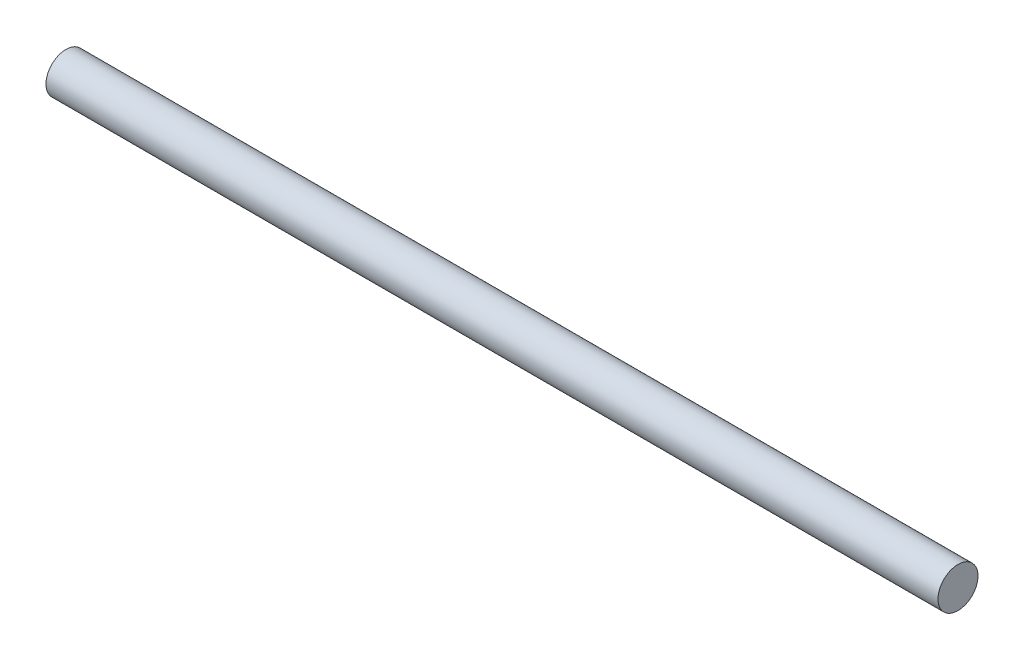
ISO-10303-21;
HEADER;
FILE_DESCRIPTION(('STEP AP214'),'2;1');
FILE_NAME('part.step','',(''),(''),'','','');
FILE_SCHEMA(('AUTOMOTIVE_DESIGN { 1 0 10303 214 1 1 1 1 }'));
ENDSEC;
DATA;
#1=APPLICATION_CONTEXT('core data for automotive mechanical design processes');
#2=APPLICATION_PROTOCOL_DEFINITION('international standard','automotive_design',2000,#1);
#3=PRODUCT_CONTEXT('',#1,'mechanical');
#4=PRODUCT('Part','Part','',(#3));
#5=PRODUCT_RELATED_PRODUCT_CATEGORY('part','',(#4));
#6=PRODUCT_DEFINITION_FORMATION('','',#4);
#7=PRODUCT_DEFINITION_CONTEXT('part definition',#1,'design');
#8=PRODUCT_DEFINITION('design','',#6,#7);
#9=PRODUCT_DEFINITION_SHAPE('','',#8);
#10=(LENGTH_UNIT() NAMED_UNIT(*) SI_UNIT(.MILLI.,.METRE.));
#11=(NAMED_UNIT(*) PLANE_ANGLE_UNIT() SI_UNIT($,.RADIAN.));
#12=(NAMED_UNIT(*) SI_UNIT($,.STERADIAN.) SOLID_ANGLE_UNIT());
#13=UNCERTAINTY_MEASURE_WITH_UNIT(LENGTH_MEASURE(1.E-05),#10,'distance_accuracy_value','');
#14=(GEOMETRIC_REPRESENTATION_CONTEXT(3) GLOBAL_UNCERTAINTY_ASSIGNED_CONTEXT((#13)) GLOBAL_UNIT_ASSIGNED_CONTEXT((#10,
#11,#12)) REPRESENTATION_CONTEXT('',''));
#15=CARTESIAN_POINT('',(0.,0.,0.));
#16=DIRECTION('',(0.,0.,1.));
#17=DIRECTION('',(1.,0.,0.));
#18=AXIS2_PLACEMENT_3D('',#15,#16,#17);
#19=CARTESIAN_POINT('',(78.,0.,0.));
#20=DIRECTION('',(-1.,0.,0.));
#21=DIRECTION('',(0.,0.,1.));
#22=AXIS2_PLACEMENT_3D('',#19,#20,#21);
#23=CYLINDRICAL_SURFACE('',#22,1.75);
#24=CARTESIAN_POINT('',(78.,0.,0.));
#25=DIRECTION('',(1.,0.,0.));
#26=DIRECTION('',(0.,0.,-1.));
#27=AXIS2_PLACEMENT_3D('',#24,#25,#26);
#28=CIRCLE('',#27,1.75);
#29=CARTESIAN_POINT('',(78.,0.,-1.75));
#30=VERTEX_POINT('',#29);
#31=EDGE_CURVE('E10',#30,#30,#28,.T.);
#32=ORIENTED_EDGE('',*,*,#31,.F.);
#33=EDGE_LOOP('',(#32));
#34=FACE_BOUND('',#33,.T.);
#35=CARTESIAN_POINT('',(0.,0.,0.));
#36=DIRECTION('',(1.,0.,0.));
#37=DIRECTION('',(0.,0.,-1.));
#38=AXIS2_PLACEMENT_3D('',#35,#36,#37);
#39=CIRCLE('',#38,1.75);
#40=CARTESIAN_POINT('',(0.,0.,-1.75));
#41=VERTEX_POINT('',#40);
#42=EDGE_CURVE('E34',#41,#41,#39,.T.);
#43=ORIENTED_EDGE('',*,*,#42,.T.);
#44=EDGE_LOOP('',(#43));
#45=FACE_BOUND('',#44,.T.);
#46=ADVANCED_FACE('F31',(#34,#45),#23,.T.);
#47=CARTESIAN_POINT('',(78.,0.,0.));
#48=DIRECTION('',(1.,0.,0.));
#49=DIRECTION('',(0.,0.,-1.));
#50=AXIS2_PLACEMENT_3D('',#47,#48,#49);
#51=PLANE('',#50);
#52=ORIENTED_EDGE('',*,*,#31,.T.);
#53=EDGE_LOOP('',(#52));
#54=FACE_BOUND('',#53,.T.);
#55=ADVANCED_FACE('F46',(#54),#51,.T.);
#56=CARTESIAN_POINT('',(0.,0.,0.));
#57=DIRECTION('',(1.,0.,0.));
#58=DIRECTION('',(0.,0.,-1.));
#59=AXIS2_PLACEMENT_3D('',#56,#57,#58);
#60=PLANE('',#59);
#61=ORIENTED_EDGE('',*,*,#42,.F.);
#62=EDGE_LOOP('',(#61));
#63=FACE_BOUND('',#62,.T.);
#64=ADVANCED_FACE('F44',(#63),#60,.F.);
#65=CLOSED_SHELL('',(#46,#55,#64));
#66=MANIFOLD_SOLID_BREP('B2',#65);
#67=ADVANCED_BREP_SHAPE_REPRESENTATION('',(#18,#66),#14);
#68=SHAPE_DEFINITION_REPRESENTATION(#9,#67);
ENDSEC;
END-ISO-10303-21;
